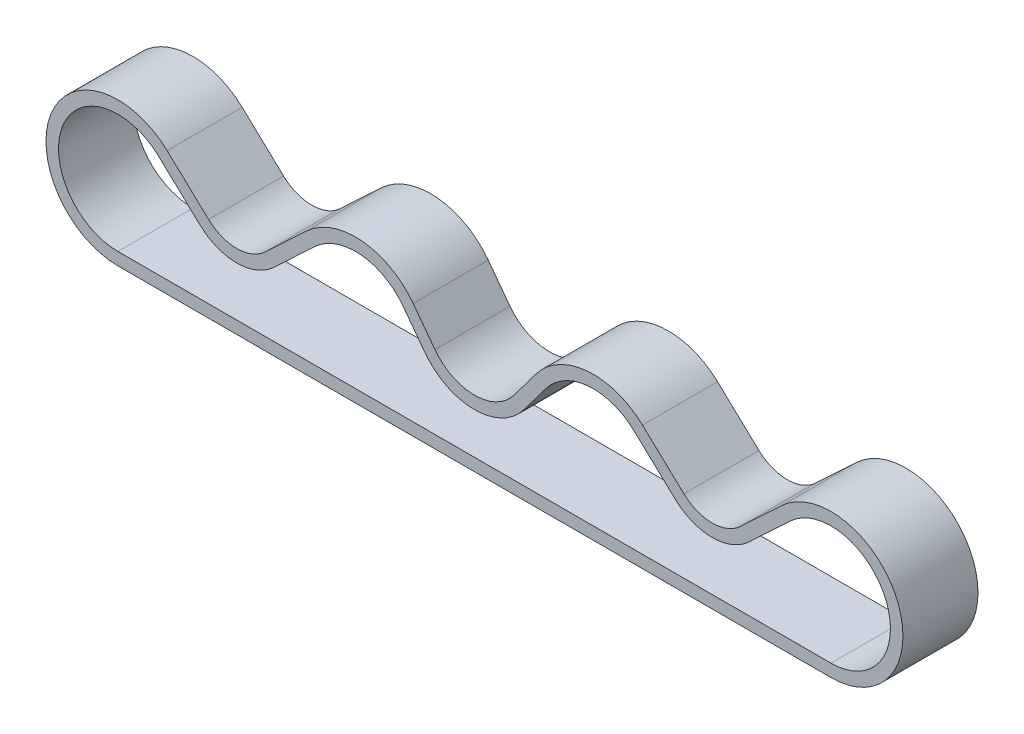
ISO-10303-21;
HEADER;
FILE_DESCRIPTION(('STEP AP214'),'2;1');
FILE_NAME('part.step','',(''),(''),'','','');
FILE_SCHEMA(('AUTOMOTIVE_DESIGN { 1 0 10303 214 1 1 1 1 }'));
ENDSEC;
DATA;
#1=APPLICATION_CONTEXT('core data for automotive mechanical design processes');
#2=APPLICATION_PROTOCOL_DEFINITION('international standard','automotive_design',2000,#1);
#3=PRODUCT_CONTEXT('',#1,'mechanical');
#4=PRODUCT('Part','Part','',(#3));
#5=PRODUCT_RELATED_PRODUCT_CATEGORY('part','',(#4));
#6=PRODUCT_DEFINITION_FORMATION('','',#4);
#7=PRODUCT_DEFINITION_CONTEXT('part definition',#1,'design');
#8=PRODUCT_DEFINITION('design','',#6,#7);
#9=PRODUCT_DEFINITION_SHAPE('','',#8);
#10=(LENGTH_UNIT() NAMED_UNIT(*) SI_UNIT(.MILLI.,.METRE.));
#11=(NAMED_UNIT(*) PLANE_ANGLE_UNIT() SI_UNIT($,.RADIAN.));
#12=(NAMED_UNIT(*) SI_UNIT($,.STERADIAN.) SOLID_ANGLE_UNIT());
#13=UNCERTAINTY_MEASURE_WITH_UNIT(LENGTH_MEASURE(1.E-05),#10,'distance_accuracy_value','');
#14=(GEOMETRIC_REPRESENTATION_CONTEXT(3) GLOBAL_UNCERTAINTY_ASSIGNED_CONTEXT((#13)) GLOBAL_UNIT_ASSIGNED_CONTEXT((#10,
#11,#12)) REPRESENTATION_CONTEXT('',''));
#15=CARTESIAN_POINT('',(0.,0.,0.));
#16=DIRECTION('',(0.,0.,1.));
#17=DIRECTION('',(1.,0.,0.));
#18=AXIS2_PLACEMENT_3D('',#15,#16,#17);
#19=CARTESIAN_POINT('',(-57.2434298669163,7.09211893265583,6.));
#20=DIRECTION('',(0.,0.,-1.));
#21=DIRECTION('',(-0.729660929498232,-0.683809131237495,0.));
#22=AXIS2_PLACEMENT_3D('',#19,#20,#21);
#23=PLANE('',#22);
#24=DIRECTION('',(-0.729660929498232,-0.683809131237495,0.));
#25=VECTOR('',#24,1.);
#26=CARTESIAN_POINT('',(-57.2434298669163,7.09211893265583,6.));
#27=LINE('',#26,#25);
#28=CARTESIAN_POINT('',(-53.9319025046156,10.1955503446148,6.));
#29=VERTEX_POINT('',#28);
#30=CARTESIAN_POINT('',(-57.2434298669163,7.09211893265583,6.));
#31=VERTEX_POINT('',#30);
#32=EDGE_CURVE('E209',#29,#31,#27,.T.);
#33=ORIENTED_EDGE('',*,*,#32,.T.);
#34=CARTESIAN_POINT('',(-59.5,9.5,6.));
#35=DIRECTION('',(0.,0.,-1.));
#36=DIRECTION('',(1.,0.,0.));
#37=AXIS2_PLACEMENT_3D('',#34,#35,#36);
#38=CIRCLE('',#37,3.30000000000001);
#39=CARTESIAN_POINT('',(-61.7565701330837,7.09211893265582,6.));
#40=VERTEX_POINT('',#39);
#41=EDGE_CURVE('E47',#31,#40,#38,.T.);
#42=ORIENTED_EDGE('',*,*,#41,.T.);
#43=DIRECTION('',(-0.729660929498233,0.683809131237493,0.));
#44=VECTOR('',#43,1.);
#45=CARTESIAN_POINT('',(-61.7565701330837,7.09211893265582,6.));
#46=LINE('',#45,#44);
#47=CARTESIAN_POINT('',(-65.0680974953844,10.1955503446148,6.));
#48=VERTEX_POINT('',#47);
#49=EDGE_CURVE('E376',#40,#48,#46,.T.);
#50=ORIENTED_EDGE('',*,*,#49,.T.);
#51=CARTESIAN_POINT('',(-69.,6.,6.));
#52=DIRECTION('',(0.,0.,1.));
#53=DIRECTION('',(1.,0.,0.));
#54=AXIS2_PLACEMENT_3D('',#51,#52,#53);
#55=CIRCLE('',#54,5.75);
#56=CARTESIAN_POINT('',(-69.,0.249999999999996,6.));
#57=VERTEX_POINT('',#56);
#58=EDGE_CURVE('E372',#48,#57,#55,.T.);
#59=ORIENTED_EDGE('',*,*,#58,.T.);
#60=DIRECTION('',(1.,0.,0.));
#61=VECTOR('',#60,1.);
#62=CARTESIAN_POINT('',(-69.,0.249999999999996,6.));
#63=LINE('',#62,#61);
#64=CARTESIAN_POINT('',(-12.,0.249999999999999,6.));
#65=VERTEX_POINT('',#64);
#66=EDGE_CURVE('E367',#57,#65,#63,.T.);
#67=ORIENTED_EDGE('',*,*,#66,.T.);
#68=CARTESIAN_POINT('',(-12.,6.,6.));
#69=DIRECTION('',(0.,0.,1.));
#70=DIRECTION('',(1.,0.,0.));
#71=AXIS2_PLACEMENT_3D('',#68,#69,#70);
#72=CIRCLE('',#71,5.75);
#73=CARTESIAN_POINT('',(-15.9319025046156,10.1955503446148,6.));
#74=VERTEX_POINT('',#73);
#75=EDGE_CURVE('E362',#65,#74,#72,.T.);
#76=ORIENTED_EDGE('',*,*,#75,.T.);
#77=DIRECTION('',(-0.729660929498231,-0.683809131237495,0.));
#78=VECTOR('',#77,1.);
#79=CARTESIAN_POINT('',(-19.2434298669163,7.09211893265584,6.));
#80=LINE('',#79,#78);
#81=CARTESIAN_POINT('',(-19.2434298669163,7.09211893265584,6.));
#82=VERTEX_POINT('',#81);
#83=EDGE_CURVE('E357',#74,#82,#80,.T.);
#84=ORIENTED_EDGE('',*,*,#83,.T.);
#85=CARTESIAN_POINT('',(-21.5,9.5,6.));
#86=DIRECTION('',(0.,0.,-1.));
#87=DIRECTION('',(1.,0.,0.));
#88=AXIS2_PLACEMENT_3D('',#85,#86,#87);
#89=CIRCLE('',#88,3.3);
#90=CARTESIAN_POINT('',(-23.7565701330837,7.09211893265583,6.));
#91=VERTEX_POINT('',#90);
#92=EDGE_CURVE('E352',#82,#91,#89,.T.);
#93=ORIENTED_EDGE('',*,*,#92,.T.);
#94=DIRECTION('',(-0.729660929498234,0.683809131237492,0.));
#95=VECTOR('',#94,1.);
#96=CARTESIAN_POINT('',(-27.0680974953844,10.1955503446148,6.));
#97=LINE('',#96,#95);
#98=CARTESIAN_POINT('',(-27.0680974953844,10.1955503446148,6.));
#99=VERTEX_POINT('',#98);
#100=EDGE_CURVE('E347',#91,#99,#97,.T.);
#101=ORIENTED_EDGE('',*,*,#100,.T.);
#102=CARTESIAN_POINT('',(-31.,6.,6.));
#103=DIRECTION('',(0.,0.,1.));
#104=DIRECTION('',(1.,0.,0.));
#105=AXIS2_PLACEMENT_3D('',#102,#103,#104);
#106=CIRCLE('',#105,5.75);
#107=CARTESIAN_POINT('',(-35.6,9.45,6.));
#108=VERTEX_POINT('',#107);
#109=EDGE_CURVE('E342',#99,#108,#106,.T.);
#110=ORIENTED_EDGE('',*,*,#109,.T.);
#111=DIRECTION('',(-0.599999999999998,-0.800000000000002,0.));
#112=VECTOR('',#111,1.);
#113=CARTESIAN_POINT('',(-37.34,7.13,6.));
#114=LINE('',#113,#112);
#115=CARTESIAN_POINT('',(-37.34,7.12999999999999,6.));
#116=VERTEX_POINT('',#115);
#117=EDGE_CURVE('E337',#108,#116,#114,.T.);
#118=ORIENTED_EDGE('',*,*,#117,.T.);
#119=CARTESIAN_POINT('',(-40.5,9.49999999999999,6.));
#120=DIRECTION('',(0.,0.,-1.));
#121=DIRECTION('',(1.,0.,0.));
#122=AXIS2_PLACEMENT_3D('',#119,#120,#121);
#123=CIRCLE('',#122,3.95);
#124=CARTESIAN_POINT('',(-43.66,7.12999999999999,6.));
#125=VERTEX_POINT('',#124);
#126=EDGE_CURVE('E332',#116,#125,#123,.T.);
#127=ORIENTED_EDGE('',*,*,#126,.T.);
#128=DIRECTION('',(-0.600000000000002,0.799999999999998,0.));
#129=VECTOR('',#128,1.);
#130=CARTESIAN_POINT('',(-45.4,9.45000000000001,6.));
#131=LINE('',#130,#129);
#132=CARTESIAN_POINT('',(-45.4,9.45,6.));
#133=VERTEX_POINT('',#132);
#134=EDGE_CURVE('E327',#125,#133,#131,.T.);
#135=ORIENTED_EDGE('',*,*,#134,.T.);
#136=CARTESIAN_POINT('',(-50.,6.00000000000001,6.));
#137=DIRECTION('',(0.,0.,1.));
#138=DIRECTION('',(1.,0.,0.));
#139=AXIS2_PLACEMENT_3D('',#136,#137,#138);
#140=CIRCLE('',#139,5.74999999999999);
#141=EDGE_CURVE('E315',#133,#29,#140,.T.);
#142=ORIENTED_EDGE('',*,*,#141,.T.);
#143=EDGE_LOOP('',(#33,#42,#50,#59,#67,#76,#84,#93,#101,#110,#118,#127,#135,#142));
#144=FACE_BOUND('',#143,.T.);
#145=DIRECTION('',(-0.729660929498231,-0.683809131237494,0.));
#146=VECTOR('',#145,1.);
#147=CARTESIAN_POINT('',(-56.5596207356788,6.3624580031576,6.));
#148=LINE('',#147,#146);
#149=CARTESIAN_POINT('',(-53.2480933733781,9.4658894151166,6.));
#150=VERTEX_POINT('',#149);
#151=CARTESIAN_POINT('',(-56.5596207356788,6.3624580031576,6.));
#152=VERTEX_POINT('',#151);
#153=EDGE_CURVE('E216',#150,#152,#148,.T.);
#154=ORIENTED_EDGE('',*,*,#153,.F.);
#155=CARTESIAN_POINT('',(-50.,6.00000000000001,6.));
#156=DIRECTION('',(0.,0.,1.));
#157=DIRECTION('',(1.,0.,0.));
#158=AXIS2_PLACEMENT_3D('',#155,#156,#157);
#159=CIRCLE('',#158,4.74999999999999);
#160=CARTESIAN_POINT('',(-46.2,8.85,6.));
#161=VERTEX_POINT('',#160);
#162=EDGE_CURVE('E287',#161,#150,#159,.T.);
#163=ORIENTED_EDGE('',*,*,#162,.F.);
#164=DIRECTION('',(-0.600000000000003,0.799999999999998,0.));
#165=VECTOR('',#164,1.);
#166=CARTESIAN_POINT('',(-46.2,8.85,6.));
#167=LINE('',#166,#165);
#168=CARTESIAN_POINT('',(-44.46,6.52999999999999,6.));
#169=VERTEX_POINT('',#168);
#170=EDGE_CURVE('E223',#169,#161,#167,.T.);
#171=ORIENTED_EDGE('',*,*,#170,.F.);
#172=CARTESIAN_POINT('',(-40.5,9.49999999999999,6.));
#173=DIRECTION('',(0.,0.,1.));
#174=DIRECTION('',(1.,0.,0.));
#175=AXIS2_PLACEMENT_3D('',#172,#173,#174);
#176=CIRCLE('',#175,4.95);
#177=CARTESIAN_POINT('',(-36.54,6.53,6.));
#178=VERTEX_POINT('',#177);
#179=EDGE_CURVE('E228',#178,#169,#176,.F.);
#180=ORIENTED_EDGE('',*,*,#179,.F.);
#181=DIRECTION('',(-0.599999999999998,-0.800000000000002,0.));
#182=VECTOR('',#181,1.);
#183=CARTESIAN_POINT('',(-36.54,6.53,6.));
#184=LINE('',#183,#182);
#185=CARTESIAN_POINT('',(-34.8,8.85,6.));
#186=VERTEX_POINT('',#185);
#187=EDGE_CURVE('E233',#186,#178,#184,.T.);
#188=ORIENTED_EDGE('',*,*,#187,.F.);
#189=CARTESIAN_POINT('',(-31.,6.,6.));
#190=DIRECTION('',(0.,0.,1.));
#191=DIRECTION('',(1.,0.,0.));
#192=AXIS2_PLACEMENT_3D('',#189,#190,#191);
#193=CIRCLE('',#192,4.75);
#194=CARTESIAN_POINT('',(-27.7519066266219,9.46588941511661,6.));
#195=VERTEX_POINT('',#194);
#196=EDGE_CURVE('E238',#195,#186,#193,.T.);
#197=ORIENTED_EDGE('',*,*,#196,.F.);
#198=DIRECTION('',(-0.729660929498234,0.683809131237492,0.));
#199=VECTOR('',#198,1.);
#200=CARTESIAN_POINT('',(-27.7519066266219,9.46588941511661,6.));
#201=LINE('',#200,#199);
#202=CARTESIAN_POINT('',(-24.4403792643212,6.3624580031576,6.));
#203=VERTEX_POINT('',#202);
#204=EDGE_CURVE('E243',#203,#195,#201,.T.);
#205=ORIENTED_EDGE('',*,*,#204,.F.);
#206=CARTESIAN_POINT('',(-21.5,9.5,6.));
#207=DIRECTION('',(0.,0.,1.));
#208=DIRECTION('',(1.,0.,0.));
#209=AXIS2_PLACEMENT_3D('',#206,#207,#208);
#210=CIRCLE('',#209,4.3);
#211=CARTESIAN_POINT('',(-18.5596207356788,6.36245800315761,6.));
#212=VERTEX_POINT('',#211);
#213=EDGE_CURVE('E248',#212,#203,#210,.F.);
#214=ORIENTED_EDGE('',*,*,#213,.F.);
#215=DIRECTION('',(-0.729660929498231,-0.683809131237495,0.));
#216=VECTOR('',#215,1.);
#217=CARTESIAN_POINT('',(-18.5596207356788,6.36245800315761,6.));
#218=LINE('',#217,#216);
#219=CARTESIAN_POINT('',(-15.2480933733781,9.4658894151166,6.));
#220=VERTEX_POINT('',#219);
#221=EDGE_CURVE('E253',#220,#212,#218,.T.);
#222=ORIENTED_EDGE('',*,*,#221,.F.);
#223=CARTESIAN_POINT('',(-12.,6.,6.));
#224=DIRECTION('',(0.,0.,1.));
#225=DIRECTION('',(1.,0.,0.));
#226=AXIS2_PLACEMENT_3D('',#223,#224,#225);
#227=CIRCLE('',#226,4.75);
#228=CARTESIAN_POINT('',(-12.,1.25,6.));
#229=VERTEX_POINT('',#228);
#230=EDGE_CURVE('E258',#229,#220,#227,.T.);
#231=ORIENTED_EDGE('',*,*,#230,.F.);
#232=DIRECTION('',(1.,0.,0.));
#233=VECTOR('',#232,1.);
#234=CARTESIAN_POINT('',(-69.,1.25,6.));
#235=LINE('',#234,#233);
#236=CARTESIAN_POINT('',(-69.,1.25,6.));
#237=VERTEX_POINT('',#236);
#238=EDGE_CURVE('E263',#237,#229,#235,.T.);
#239=ORIENTED_EDGE('',*,*,#238,.F.);
#240=CARTESIAN_POINT('',(-69.,6.,6.));
#241=DIRECTION('',(0.,0.,1.));
#242=DIRECTION('',(1.,0.,0.));
#243=AXIS2_PLACEMENT_3D('',#240,#241,#242);
#244=CIRCLE('',#243,4.75);
#245=CARTESIAN_POINT('',(-65.7519066266219,9.4658894151166,6.));
#246=VERTEX_POINT('',#245);
#247=EDGE_CURVE('E267',#246,#237,#244,.T.);
#248=ORIENTED_EDGE('',*,*,#247,.F.);
#249=DIRECTION('',(-0.729660929498233,0.683809131237493,0.));
#250=VECTOR('',#249,1.);
#251=CARTESIAN_POINT('',(-62.4403792643212,6.36245800315759,6.));
#252=LINE('',#251,#250);
#253=CARTESIAN_POINT('',(-62.4403792643212,6.36245800315759,6.));
#254=VERTEX_POINT('',#253);
#255=EDGE_CURVE('E199',#254,#246,#252,.T.);
#256=ORIENTED_EDGE('',*,*,#255,.F.);
#257=CARTESIAN_POINT('',(-59.5,9.5,6.));
#258=DIRECTION('',(0.,0.,1.));
#259=DIRECTION('',(1.,0.,0.));
#260=AXIS2_PLACEMENT_3D('',#257,#258,#259);
#261=CIRCLE('',#260,4.30000000000001);
#262=EDGE_CURVE('E197',#152,#254,#261,.F.);
#263=ORIENTED_EDGE('',*,*,#262,.F.);
#264=EDGE_LOOP('',(#154,#163,#171,#180,#188,#197,#205,#214,#222,#231,#239,#248,#256,#263));
#265=FACE_BOUND('',#264,.T.);
#266=ADVANCED_FACE('F37',(#144,#265),#23,.F.);
#267=CARTESIAN_POINT('',(-61.7565701330837,7.09211893265582,0.));
#268=DIRECTION('',(0.,0.,-1.));
#269=DIRECTION('',(-0.729660929498233,0.683809131237493,0.));
#270=AXIS2_PLACEMENT_3D('',#267,#268,#269);
#271=PLANE('',#270);
#272=DIRECTION('',(-0.729660929498233,0.683809131237493,0.));
#273=VECTOR('',#272,1.);
#274=CARTESIAN_POINT('',(-61.7565701330837,7.09211893265582,0.));
#275=LINE('',#274,#273);
#276=CARTESIAN_POINT('',(-61.7565701330837,7.09211893265582,0.));
#277=VERTEX_POINT('',#276);
#278=CARTESIAN_POINT('',(-65.0680974953844,10.1955503446148,0.));
#279=VERTEX_POINT('',#278);
#280=EDGE_CURVE('E56',#277,#279,#275,.T.);
#281=ORIENTED_EDGE('',*,*,#280,.F.);
#282=CARTESIAN_POINT('',(-59.5,9.5,0.));
#283=DIRECTION('',(0.,0.,-1.));
#284=DIRECTION('',(1.,0.,0.));
#285=AXIS2_PLACEMENT_3D('',#282,#283,#284);
#286=CIRCLE('',#285,3.30000000000001);
#287=CARTESIAN_POINT('',(-57.2434298669163,7.09211893265583,0.));
#288=VERTEX_POINT('',#287);
#289=EDGE_CURVE('E11',#288,#277,#286,.T.);
#290=ORIENTED_EDGE('',*,*,#289,.F.);
#291=DIRECTION('',(-0.729660929498232,-0.683809131237495,0.));
#292=VECTOR('',#291,1.);
#293=CARTESIAN_POINT('',(-57.2434298669163,7.09211893265583,0.));
#294=LINE('',#293,#292);
#295=CARTESIAN_POINT('',(-53.9319025046156,10.1955503446148,0.));
#296=VERTEX_POINT('',#295);
#297=EDGE_CURVE('E316',#296,#288,#294,.T.);
#298=ORIENTED_EDGE('',*,*,#297,.F.);
#299=CARTESIAN_POINT('',(-50.,6.00000000000001,0.));
#300=DIRECTION('',(0.,0.,1.));
#301=DIRECTION('',(1.,0.,0.));
#302=AXIS2_PLACEMENT_3D('',#299,#300,#301);
#303=CIRCLE('',#302,5.74999999999999);
#304=CARTESIAN_POINT('',(-45.4,9.45,0.));
#305=VERTEX_POINT('',#304);
#306=EDGE_CURVE('E322',#305,#296,#303,.T.);
#307=ORIENTED_EDGE('',*,*,#306,.F.);
#308=DIRECTION('',(-0.600000000000002,0.799999999999998,0.));
#309=VECTOR('',#308,1.);
#310=CARTESIAN_POINT('',(-45.4,9.45000000000001,0.));
#311=LINE('',#310,#309);
#312=CARTESIAN_POINT('',(-43.66,7.12999999999999,0.));
#313=VERTEX_POINT('',#312);
#314=EDGE_CURVE('E326',#313,#305,#311,.T.);
#315=ORIENTED_EDGE('',*,*,#314,.F.);
#316=CARTESIAN_POINT('',(-40.5,9.49999999999999,0.));
#317=DIRECTION('',(0.,0.,-1.));
#318=DIRECTION('',(1.,0.,0.));
#319=AXIS2_PLACEMENT_3D('',#316,#317,#318);
#320=CIRCLE('',#319,3.95);
#321=CARTESIAN_POINT('',(-37.34,7.12999999999999,0.));
#322=VERTEX_POINT('',#321);
#323=EDGE_CURVE('E331',#322,#313,#320,.T.);
#324=ORIENTED_EDGE('',*,*,#323,.F.);
#325=DIRECTION('',(-0.599999999999998,-0.800000000000002,0.));
#326=VECTOR('',#325,1.);
#327=CARTESIAN_POINT('',(-37.34,7.13,0.));
#328=LINE('',#327,#326);
#329=CARTESIAN_POINT('',(-35.6,9.45,0.));
#330=VERTEX_POINT('',#329);
#331=EDGE_CURVE('E336',#330,#322,#328,.T.);
#332=ORIENTED_EDGE('',*,*,#331,.F.);
#333=CARTESIAN_POINT('',(-31.,6.,0.));
#334=DIRECTION('',(0.,0.,1.));
#335=DIRECTION('',(1.,0.,0.));
#336=AXIS2_PLACEMENT_3D('',#333,#334,#335);
#337=CIRCLE('',#336,5.75);
#338=CARTESIAN_POINT('',(-27.0680974953844,10.1955503446148,0.));
#339=VERTEX_POINT('',#338);
#340=EDGE_CURVE('E341',#339,#330,#337,.T.);
#341=ORIENTED_EDGE('',*,*,#340,.F.);
#342=DIRECTION('',(-0.729660929498234,0.683809131237492,0.));
#343=VECTOR('',#342,1.);
#344=CARTESIAN_POINT('',(-27.0680974953844,10.1955503446148,0.));
#345=LINE('',#344,#343);
#346=CARTESIAN_POINT('',(-23.7565701330837,7.09211893265583,0.));
#347=VERTEX_POINT('',#346);
#348=EDGE_CURVE('E346',#347,#339,#345,.T.);
#349=ORIENTED_EDGE('',*,*,#348,.F.);
#350=CARTESIAN_POINT('',(-21.5,9.5,0.));
#351=DIRECTION('',(0.,0.,-1.));
#352=DIRECTION('',(1.,0.,0.));
#353=AXIS2_PLACEMENT_3D('',#350,#351,#352);
#354=CIRCLE('',#353,3.3);
#355=CARTESIAN_POINT('',(-19.2434298669163,7.09211893265584,0.));
#356=VERTEX_POINT('',#355);
#357=EDGE_CURVE('E351',#356,#347,#354,.T.);
#358=ORIENTED_EDGE('',*,*,#357,.F.);
#359=DIRECTION('',(-0.729660929498231,-0.683809131237495,0.));
#360=VECTOR('',#359,1.);
#361=CARTESIAN_POINT('',(-19.2434298669163,7.09211893265584,0.));
#362=LINE('',#361,#360);
#363=CARTESIAN_POINT('',(-15.9319025046156,10.1955503446148,0.));
#364=VERTEX_POINT('',#363);
#365=EDGE_CURVE('E356',#364,#356,#362,.T.);
#366=ORIENTED_EDGE('',*,*,#365,.F.);
#367=CARTESIAN_POINT('',(-12.,6.,0.));
#368=DIRECTION('',(0.,0.,1.));
#369=DIRECTION('',(1.,0.,0.));
#370=AXIS2_PLACEMENT_3D('',#367,#368,#369);
#371=CIRCLE('',#370,5.75);
#372=CARTESIAN_POINT('',(-12.,0.249999999999999,0.));
#373=VERTEX_POINT('',#372);
#374=EDGE_CURVE('E361',#373,#364,#371,.T.);
#375=ORIENTED_EDGE('',*,*,#374,.F.);
#376=DIRECTION('',(1.,0.,0.));
#377=VECTOR('',#376,1.);
#378=CARTESIAN_POINT('',(-69.,0.249999999999996,0.));
#379=LINE('',#378,#377);
#380=CARTESIAN_POINT('',(-69.,0.249999999999996,0.));
#381=VERTEX_POINT('',#380);
#382=EDGE_CURVE('E366',#381,#373,#379,.T.);
#383=ORIENTED_EDGE('',*,*,#382,.F.);
#384=CARTESIAN_POINT('',(-69.,6.,0.));
#385=DIRECTION('',(0.,0.,1.));
#386=DIRECTION('',(1.,0.,0.));
#387=AXIS2_PLACEMENT_3D('',#384,#385,#386);
#388=CIRCLE('',#387,5.75);
#389=EDGE_CURVE('E371',#279,#381,#388,.T.);
#390=ORIENTED_EDGE('',*,*,#389,.F.);
#391=EDGE_LOOP('',(#281,#290,#298,#307,#315,#324,#332,#341,#349,#358,#366,#375,#383,#390));
#392=FACE_BOUND('',#391,.T.);
#393=DIRECTION('',(-0.729660929498233,0.683809131237493,0.));
#394=VECTOR('',#393,1.);
#395=CARTESIAN_POINT('',(-62.4403792643212,6.36245800315759,0.));
#396=LINE('',#395,#394);
#397=CARTESIAN_POINT('',(-62.4403792643212,6.36245800315759,0.));
#398=VERTEX_POINT('',#397);
#399=CARTESIAN_POINT('',(-65.7519066266219,9.46588941511661,0.));
#400=VERTEX_POINT('',#399);
#401=EDGE_CURVE('E41',#398,#400,#396,.T.);
#402=ORIENTED_EDGE('',*,*,#401,.T.);
#403=CARTESIAN_POINT('',(-69.,6.,0.));
#404=DIRECTION('',(0.,0.,1.));
#405=DIRECTION('',(1.,0.,0.));
#406=AXIS2_PLACEMENT_3D('',#403,#404,#405);
#407=CIRCLE('',#406,4.75);
#408=CARTESIAN_POINT('',(-69.,1.25,0.));
#409=VERTEX_POINT('',#408);
#410=EDGE_CURVE('E269',#400,#409,#407,.T.);
#411=ORIENTED_EDGE('',*,*,#410,.T.);
#412=DIRECTION('',(1.,0.,0.));
#413=VECTOR('',#412,1.);
#414=CARTESIAN_POINT('',(-69.,1.25,0.));
#415=LINE('',#414,#413);
#416=CARTESIAN_POINT('',(-12.,1.25,0.));
#417=VERTEX_POINT('',#416);
#418=EDGE_CURVE('E265',#409,#417,#415,.T.);
#419=ORIENTED_EDGE('',*,*,#418,.T.);
#420=CARTESIAN_POINT('',(-12.,6.,0.));
#421=DIRECTION('',(0.,0.,1.));
#422=DIRECTION('',(1.,0.,0.));
#423=AXIS2_PLACEMENT_3D('',#420,#421,#422);
#424=CIRCLE('',#423,4.75);
#425=CARTESIAN_POINT('',(-15.2480933733781,9.4658894151166,0.));
#426=VERTEX_POINT('',#425);
#427=EDGE_CURVE('E260',#417,#426,#424,.T.);
#428=ORIENTED_EDGE('',*,*,#427,.T.);
#429=DIRECTION('',(-0.729660929498231,-0.683809131237495,0.));
#430=VECTOR('',#429,1.);
#431=CARTESIAN_POINT('',(-18.5596207356788,6.36245800315761,0.));
#432=LINE('',#431,#430);
#433=CARTESIAN_POINT('',(-18.5596207356788,6.36245800315761,0.));
#434=VERTEX_POINT('',#433);
#435=EDGE_CURVE('E255',#426,#434,#432,.T.);
#436=ORIENTED_EDGE('',*,*,#435,.T.);
#437=CARTESIAN_POINT('',(-21.5,9.5,0.));
#438=DIRECTION('',(0.,0.,1.));
#439=DIRECTION('',(1.,0.,0.));
#440=AXIS2_PLACEMENT_3D('',#437,#438,#439);
#441=CIRCLE('',#440,4.3);
#442=CARTESIAN_POINT('',(-24.4403792643212,6.3624580031576,0.));
#443=VERTEX_POINT('',#442);
#444=EDGE_CURVE('E250',#434,#443,#441,.F.);
#445=ORIENTED_EDGE('',*,*,#444,.T.);
#446=DIRECTION('',(-0.729660929498234,0.683809131237492,0.));
#447=VECTOR('',#446,1.);
#448=CARTESIAN_POINT('',(-27.7519066266219,9.46588941511661,0.));
#449=LINE('',#448,#447);
#450=CARTESIAN_POINT('',(-27.7519066266219,9.46588941511661,0.));
#451=VERTEX_POINT('',#450);
#452=EDGE_CURVE('E245',#443,#451,#449,.T.);
#453=ORIENTED_EDGE('',*,*,#452,.T.);
#454=CARTESIAN_POINT('',(-31.,6.,0.));
#455=DIRECTION('',(0.,0.,1.));
#456=DIRECTION('',(1.,0.,0.));
#457=AXIS2_PLACEMENT_3D('',#454,#455,#456);
#458=CIRCLE('',#457,4.75);
#459=CARTESIAN_POINT('',(-34.8,8.85,0.));
#460=VERTEX_POINT('',#459);
#461=EDGE_CURVE('E240',#451,#460,#458,.T.);
#462=ORIENTED_EDGE('',*,*,#461,.T.);
#463=DIRECTION('',(-0.599999999999998,-0.800000000000002,0.));
#464=VECTOR('',#463,1.);
#465=CARTESIAN_POINT('',(-36.54,6.53,0.));
#466=LINE('',#465,#464);
#467=CARTESIAN_POINT('',(-36.54,6.53,0.));
#468=VERTEX_POINT('',#467);
#469=EDGE_CURVE('E235',#460,#468,#466,.T.);
#470=ORIENTED_EDGE('',*,*,#469,.T.);
#471=CARTESIAN_POINT('',(-40.5,9.49999999999999,0.));
#472=DIRECTION('',(0.,0.,1.));
#473=DIRECTION('',(1.,0.,0.));
#474=AXIS2_PLACEMENT_3D('',#471,#472,#473);
#475=CIRCLE('',#474,4.95);
#476=CARTESIAN_POINT('',(-44.46,6.52999999999998,0.));
#477=VERTEX_POINT('',#476);
#478=EDGE_CURVE('E230',#468,#477,#475,.F.);
#479=ORIENTED_EDGE('',*,*,#478,.T.);
#480=DIRECTION('',(-0.600000000000003,0.799999999999998,0.));
#481=VECTOR('',#480,1.);
#482=CARTESIAN_POINT('',(-46.2,8.85,0.));
#483=LINE('',#482,#481);
#484=CARTESIAN_POINT('',(-46.2,8.85,0.));
#485=VERTEX_POINT('',#484);
#486=EDGE_CURVE('E225',#477,#485,#483,.T.);
#487=ORIENTED_EDGE('',*,*,#486,.T.);
#488=CARTESIAN_POINT('',(-50.,6.00000000000001,0.));
#489=DIRECTION('',(0.,0.,1.));
#490=DIRECTION('',(1.,0.,0.));
#491=AXIS2_PLACEMENT_3D('',#488,#489,#490);
#492=CIRCLE('',#491,4.74999999999999);
#493=CARTESIAN_POINT('',(-53.2480933733781,9.4658894151166,0.));
#494=VERTEX_POINT('',#493);
#495=EDGE_CURVE('E221',#485,#494,#492,.T.);
#496=ORIENTED_EDGE('',*,*,#495,.T.);
#497=DIRECTION('',(-0.729660929498231,-0.683809131237494,0.));
#498=VECTOR('',#497,1.);
#499=CARTESIAN_POINT('',(-56.5596207356788,6.3624580031576,0.));
#500=LINE('',#499,#498);
#501=CARTESIAN_POINT('',(-56.5596207356788,6.3624580031576,0.));
#502=VERTEX_POINT('',#501);
#503=EDGE_CURVE('E208',#494,#502,#500,.T.);
#504=ORIENTED_EDGE('',*,*,#503,.T.);
#505=CARTESIAN_POINT('',(-59.5,9.5,0.));
#506=DIRECTION('',(0.,0.,1.));
#507=DIRECTION('',(1.,0.,0.));
#508=AXIS2_PLACEMENT_3D('',#505,#506,#507);
#509=CIRCLE('',#508,4.30000000000001);
#510=EDGE_CURVE('E195',#502,#398,#509,.F.);
#511=ORIENTED_EDGE('',*,*,#510,.T.);
#512=EDGE_LOOP('',(#402,#411,#419,#428,#436,#445,#453,#462,#470,#479,#487,#496,#504,#511));
#513=FACE_BOUND('',#512,.T.);
#514=ADVANCED_FACE('F39',(#392,#513),#271,.T.);
#515=CARTESIAN_POINT('',(-59.5,9.5,0.));
#516=DIRECTION('',(0.,0.,1.));
#517=DIRECTION('',(1.,0.,0.));
#518=AXIS2_PLACEMENT_3D('',#515,#516,#517);
#519=CYLINDRICAL_SURFACE('',#518,3.30000000000001);
#520=ORIENTED_EDGE('',*,*,#41,.F.);
#521=DIRECTION('',(0.,0.,1.));
#522=VECTOR('',#521,1.);
#523=CARTESIAN_POINT('',(-57.2434298669163,7.09211893265583,0.));
#524=LINE('',#523,#522);
#525=EDGE_CURVE('E312',#288,#31,#524,.T.);
#526=ORIENTED_EDGE('',*,*,#525,.F.);
#527=ORIENTED_EDGE('',*,*,#289,.T.);
#528=DIRECTION('',(0.,0.,1.));
#529=VECTOR('',#528,1.);
#530=CARTESIAN_POINT('',(-61.7565701330837,7.09211893265582,0.));
#531=LINE('',#530,#529);
#532=EDGE_CURVE('E373',#277,#40,#531,.T.);
#533=ORIENTED_EDGE('',*,*,#532,.T.);
#534=EDGE_LOOP('',(#520,#526,#527,#533));
#535=FACE_BOUND('',#534,.T.);
#536=ADVANCED_FACE('F481',(#535),#519,.F.);
#537=CARTESIAN_POINT('',(-61.7565701330837,7.09211893265582,0.));
#538=DIRECTION('',(0.683809131237493,0.729660929498233,0.));
#539=DIRECTION('',(-0.729660929498233,0.683809131237493,0.));
#540=AXIS2_PLACEMENT_3D('',#537,#538,#539);
#541=PLANE('',#540);
#542=ORIENTED_EDGE('',*,*,#49,.F.);
#543=ORIENTED_EDGE('',*,*,#532,.F.);
#544=ORIENTED_EDGE('',*,*,#280,.T.);
#545=DIRECTION('',(0.,0.,1.));
#546=VECTOR('',#545,1.);
#547=CARTESIAN_POINT('',(-65.0680974953844,10.1955503446148,0.));
#548=LINE('',#547,#546);
#549=EDGE_CURVE('E368',#279,#48,#548,.T.);
#550=ORIENTED_EDGE('',*,*,#549,.T.);
#551=EDGE_LOOP('',(#542,#543,#544,#550));
#552=FACE_BOUND('',#551,.T.);
#553=ADVANCED_FACE('F479',(#552),#541,.T.);
#554=CARTESIAN_POINT('',(-69.,6.,0.));
#555=DIRECTION('',(0.,0.,1.));
#556=DIRECTION('',(1.,0.,0.));
#557=AXIS2_PLACEMENT_3D('',#554,#555,#556);
#558=CYLINDRICAL_SURFACE('',#557,5.75);
#559=ORIENTED_EDGE('',*,*,#58,.F.);
#560=ORIENTED_EDGE('',*,*,#549,.F.);
#561=ORIENTED_EDGE('',*,*,#389,.T.);
#562=DIRECTION('',(0.,0.,1.));
#563=VECTOR('',#562,1.);
#564=CARTESIAN_POINT('',(-69.,0.249999999999996,0.));
#565=LINE('',#564,#563);
#566=EDGE_CURVE('E363',#381,#57,#565,.T.);
#567=ORIENTED_EDGE('',*,*,#566,.T.);
#568=EDGE_LOOP('',(#559,#560,#561,#567));
#569=FACE_BOUND('',#568,.T.);
#570=ADVANCED_FACE('F470',(#569),#558,.T.);
#571=CARTESIAN_POINT('',(-69.,0.249999999999996,0.));
#572=DIRECTION('',(0.,-1.,0.));
#573=DIRECTION('',(1.,0.,0.));
#574=AXIS2_PLACEMENT_3D('',#571,#572,#573);
#575=PLANE('',#574);
#576=ORIENTED_EDGE('',*,*,#66,.F.);
#577=ORIENTED_EDGE('',*,*,#566,.F.);
#578=ORIENTED_EDGE('',*,*,#382,.T.);
#579=DIRECTION('',(0.,0.,1.));
#580=VECTOR('',#579,1.);
#581=CARTESIAN_POINT('',(-12.,0.249999999999999,0.));
#582=LINE('',#581,#580);
#583=EDGE_CURVE('E358',#373,#65,#582,.T.);
#584=ORIENTED_EDGE('',*,*,#583,.T.);
#585=EDGE_LOOP('',(#576,#577,#578,#584));
#586=FACE_BOUND('',#585,.T.);
#587=ADVANCED_FACE('F476',(#586),#575,.T.);
#588=CARTESIAN_POINT('',(-12.,6.,0.));
#589=DIRECTION('',(0.,0.,1.));
#590=DIRECTION('',(1.,0.,0.));
#591=AXIS2_PLACEMENT_3D('',#588,#589,#590);
#592=CYLINDRICAL_SURFACE('',#591,5.75);
#593=ORIENTED_EDGE('',*,*,#75,.F.);
#594=ORIENTED_EDGE('',*,*,#583,.F.);
#595=ORIENTED_EDGE('',*,*,#374,.T.);
#596=DIRECTION('',(0.,0.,1.));
#597=VECTOR('',#596,1.);
#598=CARTESIAN_POINT('',(-15.9319025046156,10.1955503446148,0.));
#599=LINE('',#598,#597);
#600=EDGE_CURVE('E353',#364,#74,#599,.T.);
#601=ORIENTED_EDGE('',*,*,#600,.T.);
#602=EDGE_LOOP('',(#593,#594,#595,#601));
#603=FACE_BOUND('',#602,.T.);
#604=ADVANCED_FACE('F576',(#603),#592,.T.);
#605=CARTESIAN_POINT('',(-19.2434298669163,7.09211893265584,0.));
#606=DIRECTION('',(-0.683809131237495,0.729660929498231,0.));
#607=DIRECTION('',(-0.729660929498231,-0.683809131237495,0.));
#608=AXIS2_PLACEMENT_3D('',#605,#606,#607);
#609=PLANE('',#608);
#610=ORIENTED_EDGE('',*,*,#83,.F.);
#611=ORIENTED_EDGE('',*,*,#600,.F.);
#612=ORIENTED_EDGE('',*,*,#365,.T.);
#613=DIRECTION('',(0.,0.,1.));
#614=VECTOR('',#613,1.);
#615=CARTESIAN_POINT('',(-19.2434298669163,7.09211893265584,0.));
#616=LINE('',#615,#614);
#617=EDGE_CURVE('E348',#356,#82,#616,.T.);
#618=ORIENTED_EDGE('',*,*,#617,.T.);
#619=EDGE_LOOP('',(#610,#611,#612,#618));
#620=FACE_BOUND('',#619,.T.);
#621=ADVANCED_FACE('F572',(#620),#609,.T.);
#622=CARTESIAN_POINT('',(-21.5,9.5,0.));
#623=DIRECTION('',(0.,0.,1.));
#624=DIRECTION('',(1.,0.,0.));
#625=AXIS2_PLACEMENT_3D('',#622,#623,#624);
#626=CYLINDRICAL_SURFACE('',#625,3.3);
#627=ORIENTED_EDGE('',*,*,#92,.F.);
#628=ORIENTED_EDGE('',*,*,#617,.F.);
#629=ORIENTED_EDGE('',*,*,#357,.T.);
#630=DIRECTION('',(0.,0.,1.));
#631=VECTOR('',#630,1.);
#632=CARTESIAN_POINT('',(-23.7565701330837,7.09211893265583,0.));
#633=LINE('',#632,#631);
#634=EDGE_CURVE('E343',#347,#91,#633,.T.);
#635=ORIENTED_EDGE('',*,*,#634,.T.);
#636=EDGE_LOOP('',(#627,#628,#629,#635));
#637=FACE_BOUND('',#636,.T.);
#638=ADVANCED_FACE('F568',(#637),#626,.F.);
#639=CARTESIAN_POINT('',(-27.0680974953844,10.1955503446148,0.));
#640=DIRECTION('',(0.683809131237492,0.729660929498234,0.));
#641=DIRECTION('',(-0.729660929498234,0.683809131237492,0.));
#642=AXIS2_PLACEMENT_3D('',#639,#640,#641);
#643=PLANE('',#642);
#644=ORIENTED_EDGE('',*,*,#100,.F.);
#645=ORIENTED_EDGE('',*,*,#634,.F.);
#646=ORIENTED_EDGE('',*,*,#348,.T.);
#647=DIRECTION('',(0.,0.,1.));
#648=VECTOR('',#647,1.);
#649=CARTESIAN_POINT('',(-27.0680974953844,10.1955503446148,0.));
#650=LINE('',#649,#648);
#651=EDGE_CURVE('E338',#339,#99,#650,.T.);
#652=ORIENTED_EDGE('',*,*,#651,.T.);
#653=EDGE_LOOP('',(#644,#645,#646,#652));
#654=FACE_BOUND('',#653,.T.);
#655=ADVANCED_FACE('F564',(#654),#643,.T.);
#656=CARTESIAN_POINT('',(-31.,6.,0.));
#657=DIRECTION('',(0.,0.,1.));
#658=DIRECTION('',(1.,0.,0.));
#659=AXIS2_PLACEMENT_3D('',#656,#657,#658);
#660=CYLINDRICAL_SURFACE('',#659,5.75);
#661=ORIENTED_EDGE('',*,*,#109,.F.);
#662=ORIENTED_EDGE('',*,*,#651,.F.);
#663=ORIENTED_EDGE('',*,*,#340,.T.);
#664=DIRECTION('',(0.,0.,1.));
#665=VECTOR('',#664,1.);
#666=CARTESIAN_POINT('',(-35.6,9.45,0.));
#667=LINE('',#666,#665);
#668=EDGE_CURVE('E333',#330,#108,#667,.T.);
#669=ORIENTED_EDGE('',*,*,#668,.T.);
#670=EDGE_LOOP('',(#661,#662,#663,#669));
#671=FACE_BOUND('',#670,.T.);
#672=ADVANCED_FACE('F560',(#671),#660,.T.);
#673=CARTESIAN_POINT('',(-37.34,7.13,0.));
#674=DIRECTION('',(-0.800000000000002,0.599999999999998,0.));
#675=DIRECTION('',(-0.599999999999998,-0.800000000000002,0.));
#676=AXIS2_PLACEMENT_3D('',#673,#674,#675);
#677=PLANE('',#676);
#678=ORIENTED_EDGE('',*,*,#117,.F.);
#679=ORIENTED_EDGE('',*,*,#668,.F.);
#680=ORIENTED_EDGE('',*,*,#331,.T.);
#681=DIRECTION('',(0.,0.,1.));
#682=VECTOR('',#681,1.);
#683=CARTESIAN_POINT('',(-37.34,7.12999999999999,0.));
#684=LINE('',#683,#682);
#685=EDGE_CURVE('E328',#322,#116,#684,.T.);
#686=ORIENTED_EDGE('',*,*,#685,.T.);
#687=EDGE_LOOP('',(#678,#679,#680,#686));
#688=FACE_BOUND('',#687,.T.);
#689=ADVANCED_FACE('F557',(#688),#677,.T.);
#690=CARTESIAN_POINT('',(-40.5,9.49999999999999,0.));
#691=DIRECTION('',(0.,0.,1.));
#692=DIRECTION('',(1.,0.,0.));
#693=AXIS2_PLACEMENT_3D('',#690,#691,#692);
#694=CYLINDRICAL_SURFACE('',#693,3.95);
#695=ORIENTED_EDGE('',*,*,#126,.F.);
#696=ORIENTED_EDGE('',*,*,#685,.F.);
#697=ORIENTED_EDGE('',*,*,#323,.T.);
#698=DIRECTION('',(0.,0.,1.));
#699=VECTOR('',#698,1.);
#700=CARTESIAN_POINT('',(-43.66,7.12999999999999,0.));
#701=LINE('',#700,#699);
#702=EDGE_CURVE('E323',#313,#125,#701,.T.);
#703=ORIENTED_EDGE('',*,*,#702,.T.);
#704=EDGE_LOOP('',(#695,#696,#697,#703));
#705=FACE_BOUND('',#704,.T.);
#706=ADVANCED_FACE('F554',(#705),#694,.F.);
#707=CARTESIAN_POINT('',(-45.4,9.45000000000001,0.));
#708=DIRECTION('',(0.799999999999998,0.600000000000003,0.));
#709=DIRECTION('',(-0.600000000000003,0.799999999999998,0.));
#710=AXIS2_PLACEMENT_3D('',#707,#708,#709);
#711=PLANE('',#710);
#712=ORIENTED_EDGE('',*,*,#134,.F.);
#713=ORIENTED_EDGE('',*,*,#702,.F.);
#714=ORIENTED_EDGE('',*,*,#314,.T.);
#715=DIRECTION('',(0.,0.,1.));
#716=VECTOR('',#715,1.);
#717=CARTESIAN_POINT('',(-45.4,9.45,0.));
#718=LINE('',#717,#716);
#719=EDGE_CURVE('E319',#305,#133,#718,.T.);
#720=ORIENTED_EDGE('',*,*,#719,.T.);
#721=EDGE_LOOP('',(#712,#713,#714,#720));
#722=FACE_BOUND('',#721,.T.);
#723=ADVANCED_FACE('F445',(#722),#711,.T.);
#724=CARTESIAN_POINT('',(-50.,6.00000000000001,0.));
#725=DIRECTION('',(0.,0.,1.));
#726=DIRECTION('',(1.,0.,0.));
#727=AXIS2_PLACEMENT_3D('',#724,#725,#726);
#728=CYLINDRICAL_SURFACE('',#727,5.74999999999999);
#729=ORIENTED_EDGE('',*,*,#141,.F.);
#730=ORIENTED_EDGE('',*,*,#719,.F.);
#731=ORIENTED_EDGE('',*,*,#306,.T.);
#732=DIRECTION('',(0.,0.,1.));
#733=VECTOR('',#732,1.);
#734=CARTESIAN_POINT('',(-53.9319025046156,10.1955503446148,0.));
#735=LINE('',#734,#733);
#736=EDGE_CURVE('E211',#296,#29,#735,.T.);
#737=ORIENTED_EDGE('',*,*,#736,.T.);
#738=EDGE_LOOP('',(#729,#730,#731,#737));
#739=FACE_BOUND('',#738,.T.);
#740=ADVANCED_FACE('F432',(#739),#728,.T.);
#741=CARTESIAN_POINT('',(-57.2434298669163,7.09211893265583,0.));
#742=DIRECTION('',(-0.683809131237494,0.729660929498231,0.));
#743=DIRECTION('',(-0.729660929498231,-0.683809131237494,0.));
#744=AXIS2_PLACEMENT_3D('',#741,#742,#743);
#745=PLANE('',#744);
#746=ORIENTED_EDGE('',*,*,#32,.F.);
#747=ORIENTED_EDGE('',*,*,#736,.F.);
#748=ORIENTED_EDGE('',*,*,#297,.T.);
#749=ORIENTED_EDGE('',*,*,#525,.T.);
#750=EDGE_LOOP('',(#746,#747,#748,#749));
#751=FACE_BOUND('',#750,.T.);
#752=ADVANCED_FACE('F439',(#751),#745,.T.);
#753=CARTESIAN_POINT('',(-59.5,9.5,0.));
#754=DIRECTION('',(0.,0.,1.));
#755=DIRECTION('',(1.,0.,0.));
#756=AXIS2_PLACEMENT_3D('',#753,#754,#755);
#757=CYLINDRICAL_SURFACE('',#756,4.30000000000001);
#758=ORIENTED_EDGE('',*,*,#262,.T.);
#759=DIRECTION('',(0.,0.,1.));
#760=VECTOR('',#759,1.);
#761=CARTESIAN_POINT('',(-62.4403792643212,6.36245800315759,0.));
#762=LINE('',#761,#760);
#763=EDGE_CURVE('E192',#398,#254,#762,.T.);
#764=ORIENTED_EDGE('',*,*,#763,.F.);
#765=ORIENTED_EDGE('',*,*,#510,.F.);
#766=DIRECTION('',(0.,0.,1.));
#767=VECTOR('',#766,1.);
#768=CARTESIAN_POINT('',(-56.5596207356788,6.3624580031576,0.));
#769=LINE('',#768,#767);
#770=EDGE_CURVE('E219',#502,#152,#769,.T.);
#771=ORIENTED_EDGE('',*,*,#770,.T.);
#772=EDGE_LOOP('',(#758,#764,#765,#771));
#773=FACE_BOUND('',#772,.T.);
#774=ADVANCED_FACE('F193',(#773),#757,.T.);
#775=CARTESIAN_POINT('',(-62.4403792643212,6.36245800315759,0.));
#776=DIRECTION('',(0.683809131237493,0.729660929498233,0.));
#777=DIRECTION('',(-0.729660929498233,0.683809131237493,0.));
#778=AXIS2_PLACEMENT_3D('',#775,#776,#777);
#779=PLANE('',#778);
#780=ORIENTED_EDGE('',*,*,#255,.T.);
#781=DIRECTION('',(0.,0.,1.));
#782=VECTOR('',#781,1.);
#783=CARTESIAN_POINT('',(-65.7519066266219,9.4658894151166,0.));
#784=LINE('',#783,#782);
#785=EDGE_CURVE('E186',#400,#246,#784,.T.);
#786=ORIENTED_EDGE('',*,*,#785,.F.);
#787=ORIENTED_EDGE('',*,*,#401,.F.);
#788=ORIENTED_EDGE('',*,*,#763,.T.);
#789=EDGE_LOOP('',(#780,#786,#787,#788));
#790=FACE_BOUND('',#789,.T.);
#791=ADVANCED_FACE('F202',(#790),#779,.F.);
#792=CARTESIAN_POINT('',(-69.,6.,0.));
#793=DIRECTION('',(0.,0.,1.));
#794=DIRECTION('',(1.,0.,0.));
#795=AXIS2_PLACEMENT_3D('',#792,#793,#794);
#796=CYLINDRICAL_SURFACE('',#795,4.75);
#797=ORIENTED_EDGE('',*,*,#247,.T.);
#798=DIRECTION('',(0.,0.,1.));
#799=VECTOR('',#798,1.);
#800=CARTESIAN_POINT('',(-69.,1.25,0.));
#801=LINE('',#800,#799);
#802=EDGE_CURVE('E268',#409,#237,#801,.T.);
#803=ORIENTED_EDGE('',*,*,#802,.F.);
#804=ORIENTED_EDGE('',*,*,#410,.F.);
#805=ORIENTED_EDGE('',*,*,#785,.T.);
#806=EDGE_LOOP('',(#797,#803,#804,#805));
#807=FACE_BOUND('',#806,.T.);
#808=ADVANCED_FACE('F537',(#807),#796,.F.);
#809=CARTESIAN_POINT('',(-69.,1.25,0.));
#810=DIRECTION('',(0.,-1.,0.));
#811=DIRECTION('',(1.,0.,0.));
#812=AXIS2_PLACEMENT_3D('',#809,#810,#811);
#813=PLANE('',#812);
#814=ORIENTED_EDGE('',*,*,#238,.T.);
#815=DIRECTION('',(0.,0.,1.));
#816=VECTOR('',#815,1.);
#817=CARTESIAN_POINT('',(-12.,1.25,0.));
#818=LINE('',#817,#816);
#819=EDGE_CURVE('E264',#417,#229,#818,.T.);
#820=ORIENTED_EDGE('',*,*,#819,.F.);
#821=ORIENTED_EDGE('',*,*,#418,.F.);
#822=ORIENTED_EDGE('',*,*,#802,.T.);
#823=EDGE_LOOP('',(#814,#820,#821,#822));
#824=FACE_BOUND('',#823,.T.);
#825=ADVANCED_FACE('F533',(#824),#813,.F.);
#826=CARTESIAN_POINT('',(-12.,6.,0.));
#827=DIRECTION('',(0.,0.,1.));
#828=DIRECTION('',(1.,0.,0.));
#829=AXIS2_PLACEMENT_3D('',#826,#827,#828);
#830=CYLINDRICAL_SURFACE('',#829,4.75);
#831=ORIENTED_EDGE('',*,*,#230,.T.);
#832=DIRECTION('',(0.,0.,1.));
#833=VECTOR('',#832,1.);
#834=CARTESIAN_POINT('',(-15.2480933733781,9.4658894151166,0.));
#835=LINE('',#834,#833);
#836=EDGE_CURVE('E259',#426,#220,#835,.T.);
#837=ORIENTED_EDGE('',*,*,#836,.F.);
#838=ORIENTED_EDGE('',*,*,#427,.F.);
#839=ORIENTED_EDGE('',*,*,#819,.T.);
#840=EDGE_LOOP('',(#831,#837,#838,#839));
#841=FACE_BOUND('',#840,.T.);
#842=ADVANCED_FACE('F529',(#841),#830,.F.);
#843=CARTESIAN_POINT('',(-18.5596207356788,6.36245800315761,0.));
#844=DIRECTION('',(-0.683809131237495,0.729660929498231,0.));
#845=DIRECTION('',(-0.729660929498231,-0.683809131237495,0.));
#846=AXIS2_PLACEMENT_3D('',#843,#844,#845);
#847=PLANE('',#846);
#848=ORIENTED_EDGE('',*,*,#221,.T.);
#849=DIRECTION('',(0.,0.,1.));
#850=VECTOR('',#849,1.);
#851=CARTESIAN_POINT('',(-18.5596207356788,6.36245800315761,0.));
#852=LINE('',#851,#850);
#853=EDGE_CURVE('E254',#434,#212,#852,.T.);
#854=ORIENTED_EDGE('',*,*,#853,.F.);
#855=ORIENTED_EDGE('',*,*,#435,.F.);
#856=ORIENTED_EDGE('',*,*,#836,.T.);
#857=EDGE_LOOP('',(#848,#854,#855,#856));
#858=FACE_BOUND('',#857,.T.);
#859=ADVANCED_FACE('F525',(#858),#847,.F.);
#860=CARTESIAN_POINT('',(-21.5,9.5,0.));
#861=DIRECTION('',(0.,0.,1.));
#862=DIRECTION('',(1.,0.,0.));
#863=AXIS2_PLACEMENT_3D('',#860,#861,#862);
#864=CYLINDRICAL_SURFACE('',#863,4.3);
#865=ORIENTED_EDGE('',*,*,#213,.T.);
#866=DIRECTION('',(0.,0.,1.));
#867=VECTOR('',#866,1.);
#868=CARTESIAN_POINT('',(-24.4403792643212,6.3624580031576,0.));
#869=LINE('',#868,#867);
#870=EDGE_CURVE('E249',#443,#203,#869,.T.);
#871=ORIENTED_EDGE('',*,*,#870,.F.);
#872=ORIENTED_EDGE('',*,*,#444,.F.);
#873=ORIENTED_EDGE('',*,*,#853,.T.);
#874=EDGE_LOOP('',(#865,#871,#872,#873));
#875=FACE_BOUND('',#874,.T.);
#876=ADVANCED_FACE('F521',(#875),#864,.T.);
#877=CARTESIAN_POINT('',(-27.7519066266219,9.46588941511661,0.));
#878=DIRECTION('',(0.683809131237492,0.729660929498234,0.));
#879=DIRECTION('',(-0.729660929498234,0.683809131237492,0.));
#880=AXIS2_PLACEMENT_3D('',#877,#878,#879);
#881=PLANE('',#880);
#882=ORIENTED_EDGE('',*,*,#204,.T.);
#883=DIRECTION('',(0.,0.,1.));
#884=VECTOR('',#883,1.);
#885=CARTESIAN_POINT('',(-27.7519066266219,9.46588941511661,0.));
#886=LINE('',#885,#884);
#887=EDGE_CURVE('E244',#451,#195,#886,.T.);
#888=ORIENTED_EDGE('',*,*,#887,.F.);
#889=ORIENTED_EDGE('',*,*,#452,.F.);
#890=ORIENTED_EDGE('',*,*,#870,.T.);
#891=EDGE_LOOP('',(#882,#888,#889,#890));
#892=FACE_BOUND('',#891,.T.);
#893=ADVANCED_FACE('F517',(#892),#881,.F.);
#894=CARTESIAN_POINT('',(-31.,6.,0.));
#895=DIRECTION('',(0.,0.,1.));
#896=DIRECTION('',(1.,0.,0.));
#897=AXIS2_PLACEMENT_3D('',#894,#895,#896);
#898=CYLINDRICAL_SURFACE('',#897,4.75);
#899=ORIENTED_EDGE('',*,*,#196,.T.);
#900=DIRECTION('',(0.,0.,1.));
#901=VECTOR('',#900,1.);
#902=CARTESIAN_POINT('',(-34.8,8.85,0.));
#903=LINE('',#902,#901);
#904=EDGE_CURVE('E239',#460,#186,#903,.T.);
#905=ORIENTED_EDGE('',*,*,#904,.F.);
#906=ORIENTED_EDGE('',*,*,#461,.F.);
#907=ORIENTED_EDGE('',*,*,#887,.T.);
#908=EDGE_LOOP('',(#899,#905,#906,#907));
#909=FACE_BOUND('',#908,.T.);
#910=ADVANCED_FACE('F513',(#909),#898,.F.);
#911=CARTESIAN_POINT('',(-36.54,6.53,0.));
#912=DIRECTION('',(-0.800000000000002,0.599999999999998,0.));
#913=DIRECTION('',(-0.599999999999998,-0.800000000000002,0.));
#914=AXIS2_PLACEMENT_3D('',#911,#912,#913);
#915=PLANE('',#914);
#916=ORIENTED_EDGE('',*,*,#187,.T.);
#917=DIRECTION('',(0.,0.,1.));
#918=VECTOR('',#917,1.);
#919=CARTESIAN_POINT('',(-36.54,6.53,0.));
#920=LINE('',#919,#918);
#921=EDGE_CURVE('E234',#468,#178,#920,.T.);
#922=ORIENTED_EDGE('',*,*,#921,.F.);
#923=ORIENTED_EDGE('',*,*,#469,.F.);
#924=ORIENTED_EDGE('',*,*,#904,.T.);
#925=EDGE_LOOP('',(#916,#922,#923,#924));
#926=FACE_BOUND('',#925,.T.);
#927=ADVANCED_FACE('F509',(#926),#915,.F.);
#928=CARTESIAN_POINT('',(-40.5,9.49999999999999,0.));
#929=DIRECTION('',(0.,0.,1.));
#930=DIRECTION('',(1.,0.,0.));
#931=AXIS2_PLACEMENT_3D('',#928,#929,#930);
#932=CYLINDRICAL_SURFACE('',#931,4.95);
#933=ORIENTED_EDGE('',*,*,#179,.T.);
#934=DIRECTION('',(0.,0.,1.));
#935=VECTOR('',#934,1.);
#936=CARTESIAN_POINT('',(-44.46,6.52999999999999,0.));
#937=LINE('',#936,#935);
#938=EDGE_CURVE('E229',#477,#169,#937,.T.);
#939=ORIENTED_EDGE('',*,*,#938,.F.);
#940=ORIENTED_EDGE('',*,*,#478,.F.);
#941=ORIENTED_EDGE('',*,*,#921,.T.);
#942=EDGE_LOOP('',(#933,#939,#940,#941));
#943=FACE_BOUND('',#942,.T.);
#944=ADVANCED_FACE('F505',(#943),#932,.T.);
#945=CARTESIAN_POINT('',(-46.2,8.85,0.));
#946=DIRECTION('',(0.799999999999998,0.600000000000003,0.));
#947=DIRECTION('',(-0.600000000000003,0.799999999999998,0.));
#948=AXIS2_PLACEMENT_3D('',#945,#946,#947);
#949=PLANE('',#948);
#950=ORIENTED_EDGE('',*,*,#170,.T.);
#951=DIRECTION('',(0.,0.,1.));
#952=VECTOR('',#951,1.);
#953=CARTESIAN_POINT('',(-46.2,8.85,0.));
#954=LINE('',#953,#952);
#955=EDGE_CURVE('E224',#485,#161,#954,.T.);
#956=ORIENTED_EDGE('',*,*,#955,.F.);
#957=ORIENTED_EDGE('',*,*,#486,.F.);
#958=ORIENTED_EDGE('',*,*,#938,.T.);
#959=EDGE_LOOP('',(#950,#956,#957,#958));
#960=FACE_BOUND('',#959,.T.);
#961=ADVANCED_FACE('F502',(#960),#949,.F.);
#962=CARTESIAN_POINT('',(-50.,6.00000000000001,0.));
#963=DIRECTION('',(0.,0.,1.));
#964=DIRECTION('',(1.,0.,0.));
#965=AXIS2_PLACEMENT_3D('',#962,#963,#964);
#966=CYLINDRICAL_SURFACE('',#965,4.74999999999999);
#967=ORIENTED_EDGE('',*,*,#162,.T.);
#968=DIRECTION('',(0.,0.,1.));
#969=VECTOR('',#968,1.);
#970=CARTESIAN_POINT('',(-53.2480933733781,9.4658894151166,0.));
#971=LINE('',#970,#969);
#972=EDGE_CURVE('E220',#494,#150,#971,.T.);
#973=ORIENTED_EDGE('',*,*,#972,.F.);
#974=ORIENTED_EDGE('',*,*,#495,.F.);
#975=ORIENTED_EDGE('',*,*,#955,.T.);
#976=EDGE_LOOP('',(#967,#973,#974,#975));
#977=FACE_BOUND('',#976,.T.);
#978=ADVANCED_FACE('F498',(#977),#966,.F.);
#979=CARTESIAN_POINT('',(-56.5596207356788,6.3624580031576,0.));
#980=DIRECTION('',(-0.683809131237494,0.729660929498231,0.));
#981=DIRECTION('',(-0.729660929498231,-0.683809131237494,0.));
#982=AXIS2_PLACEMENT_3D('',#979,#980,#981);
#983=PLANE('',#982);
#984=ORIENTED_EDGE('',*,*,#153,.T.);
#985=ORIENTED_EDGE('',*,*,#770,.F.);
#986=ORIENTED_EDGE('',*,*,#503,.F.);
#987=ORIENTED_EDGE('',*,*,#972,.T.);
#988=EDGE_LOOP('',(#984,#985,#986,#987));
#989=FACE_BOUND('',#988,.T.);
#990=ADVANCED_FACE('F495',(#989),#983,.F.);
#991=CLOSED_SHELL('',(#266,#514,#536,#553,#570,#587,#604,#621,#638,#655,#672,#689,#706,#723,
#740,#752,#774,#791,#808,#825,#842,#859,#876,#893,#910,#927,#944,#961,#978,#990));
#992=MANIFOLD_SOLID_BREP('B2',#991);
#993=ADVANCED_BREP_SHAPE_REPRESENTATION('',(#18,#992),#14);
#994=SHAPE_DEFINITION_REPRESENTATION(#9,#993);
ENDSEC;
END-ISO-10303-21;
